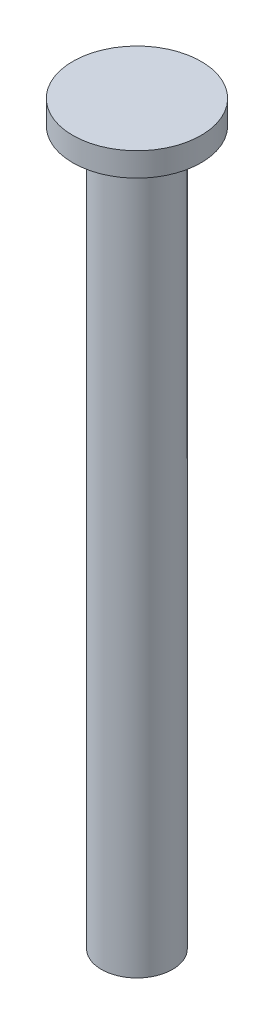
ISO-10303-21;
HEADER;
FILE_DESCRIPTION(('STEP AP214'),'2;1');
FILE_NAME('part.step','',(''),(''),'','','');
FILE_SCHEMA(('AUTOMOTIVE_DESIGN { 1 0 10303 214 1 1 1 1 }'));
ENDSEC;
DATA;
#1=APPLICATION_CONTEXT('core data for automotive mechanical design processes');
#2=APPLICATION_PROTOCOL_DEFINITION('international standard','automotive_design',2000,#1);
#3=PRODUCT_CONTEXT('',#1,'mechanical');
#4=PRODUCT('Part','Part','',(#3));
#5=PRODUCT_RELATED_PRODUCT_CATEGORY('part','',(#4));
#6=PRODUCT_DEFINITION_FORMATION('','',#4);
#7=PRODUCT_DEFINITION_CONTEXT('part definition',#1,'design');
#8=PRODUCT_DEFINITION('design','',#6,#7);
#9=PRODUCT_DEFINITION_SHAPE('','',#8);
#10=(LENGTH_UNIT() NAMED_UNIT(*) SI_UNIT(.MILLI.,.METRE.));
#11=(NAMED_UNIT(*) PLANE_ANGLE_UNIT() SI_UNIT($,.RADIAN.));
#12=(NAMED_UNIT(*) SI_UNIT($,.STERADIAN.) SOLID_ANGLE_UNIT());
#13=UNCERTAINTY_MEASURE_WITH_UNIT(LENGTH_MEASURE(1.E-05),#10,'distance_accuracy_value','');
#14=(GEOMETRIC_REPRESENTATION_CONTEXT(3) GLOBAL_UNCERTAINTY_ASSIGNED_CONTEXT((#13)) GLOBAL_UNIT_ASSIGNED_CONTEXT((#10,
#11,#12)) REPRESENTATION_CONTEXT('',''));
#15=CARTESIAN_POINT('',(0.,0.,0.));
#16=DIRECTION('',(0.,0.,1.));
#17=DIRECTION('',(1.,0.,0.));
#18=AXIS2_PLACEMENT_3D('',#15,#16,#17);
#19=CARTESIAN_POINT('',(0.,1.,0.));
#20=DIRECTION('',(0.,-1.,0.));
#21=DIRECTION('',(0.,0.,-1.));
#22=AXIS2_PLACEMENT_3D('',#19,#20,#21);
#23=CYLINDRICAL_SURFACE('',#22,2.7);
#24=CARTESIAN_POINT('',(0.,1.,0.));
#25=DIRECTION('',(0.,1.,0.));
#26=DIRECTION('',(0.,0.,1.));
#27=AXIS2_PLACEMENT_3D('',#24,#25,#26);
#28=CIRCLE('',#27,2.7);
#29=CARTESIAN_POINT('',(0.,1.,2.7));
#30=VERTEX_POINT('',#29);
#31=EDGE_CURVE('E44',#30,#30,#28,.T.);
#32=ORIENTED_EDGE('',*,*,#31,.F.);
#33=EDGE_LOOP('',(#32));
#34=FACE_BOUND('',#33,.T.);
#35=CARTESIAN_POINT('',(0.,0.,0.));
#36=DIRECTION('',(0.,1.,0.));
#37=DIRECTION('',(0.,0.,1.));
#38=AXIS2_PLACEMENT_3D('',#35,#36,#37);
#39=CIRCLE('',#38,2.7);
#40=CARTESIAN_POINT('',(0.,0.,2.7));
#41=VERTEX_POINT('',#40);
#42=EDGE_CURVE('E40',#41,#41,#39,.T.);
#43=ORIENTED_EDGE('',*,*,#42,.T.);
#44=EDGE_LOOP('',(#43));
#45=FACE_BOUND('',#44,.T.);
#46=ADVANCED_FACE('F37',(#34,#45),#23,.T.);
#47=CARTESIAN_POINT('',(0.,1.,0.));
#48=DIRECTION('',(0.,1.,0.));
#49=DIRECTION('',(0.,0.,1.));
#50=AXIS2_PLACEMENT_3D('',#47,#48,#49);
#51=PLANE('',#50);
#52=ORIENTED_EDGE('',*,*,#31,.T.);
#53=EDGE_LOOP('',(#52));
#54=FACE_BOUND('',#53,.T.);
#55=ADVANCED_FACE('F61',(#54),#51,.T.);
#56=CARTESIAN_POINT('',(0.,0.,0.));
#57=DIRECTION('',(0.,1.,0.));
#58=DIRECTION('',(0.,0.,1.));
#59=AXIS2_PLACEMENT_3D('',#56,#57,#58);
#60=PLANE('',#59);
#61=CARTESIAN_POINT('',(0.,0.,0.));
#62=DIRECTION('',(0.,-1.,0.));
#63=DIRECTION('',(0.,0.,-1.));
#64=AXIS2_PLACEMENT_3D('',#61,#62,#63);
#65=CIRCLE('',#64,1.5);
#66=CARTESIAN_POINT('',(0.,0.,-1.5));
#67=VERTEX_POINT('',#66);
#68=EDGE_CURVE('E10',#67,#67,#65,.T.);
#69=ORIENTED_EDGE('',*,*,#68,.F.);
#70=EDGE_LOOP('',(#69));
#71=FACE_BOUND('',#70,.T.);
#72=ORIENTED_EDGE('',*,*,#42,.F.);
#73=EDGE_LOOP('',(#72));
#74=FACE_BOUND('',#73,.T.);
#75=ADVANCED_FACE('F58',(#71,#74),#60,.F.);
#76=CARTESIAN_POINT('',(0.,-30.,0.));
#77=DIRECTION('',(0.,1.,0.));
#78=DIRECTION('',(0.,0.,1.));
#79=AXIS2_PLACEMENT_3D('',#76,#77,#78);
#80=CYLINDRICAL_SURFACE('',#79,1.5);
#81=CARTESIAN_POINT('',(0.,-30.,0.));
#82=DIRECTION('',(0.,-1.,0.));
#83=DIRECTION('',(0.,0.,-1.));
#84=AXIS2_PLACEMENT_3D('',#81,#82,#83);
#85=CIRCLE('',#84,1.5);
#86=CARTESIAN_POINT('',(0.,-30.,-1.5));
#87=VERTEX_POINT('',#86);
#88=EDGE_CURVE('E50',#87,#87,#85,.T.);
#89=ORIENTED_EDGE('',*,*,#88,.F.);
#90=EDGE_LOOP('',(#89));
#91=FACE_BOUND('',#90,.T.);
#92=ORIENTED_EDGE('',*,*,#68,.T.);
#93=EDGE_LOOP('',(#92));
#94=FACE_BOUND('',#93,.T.);
#95=ADVANCED_FACE('F60',(#91,#94),#80,.T.);
#96=CARTESIAN_POINT('',(0.,-30.,0.));
#97=DIRECTION('',(0.,-1.,0.));
#98=DIRECTION('',(0.,0.,-1.));
#99=AXIS2_PLACEMENT_3D('',#96,#97,#98);
#100=PLANE('',#99);
#101=ORIENTED_EDGE('',*,*,#88,.T.);
#102=EDGE_LOOP('',(#101));
#103=FACE_BOUND('',#102,.T.);
#104=ADVANCED_FACE('F67',(#103),#100,.T.);
#105=CLOSED_SHELL('',(#46,#55,#75,#95,#104));
#106=MANIFOLD_SOLID_BREP('B2',#105);
#107=ADVANCED_BREP_SHAPE_REPRESENTATION('',(#18,#106),#14);
#108=SHAPE_DEFINITION_REPRESENTATION(#9,#107);
ENDSEC;
END-ISO-10303-21;
